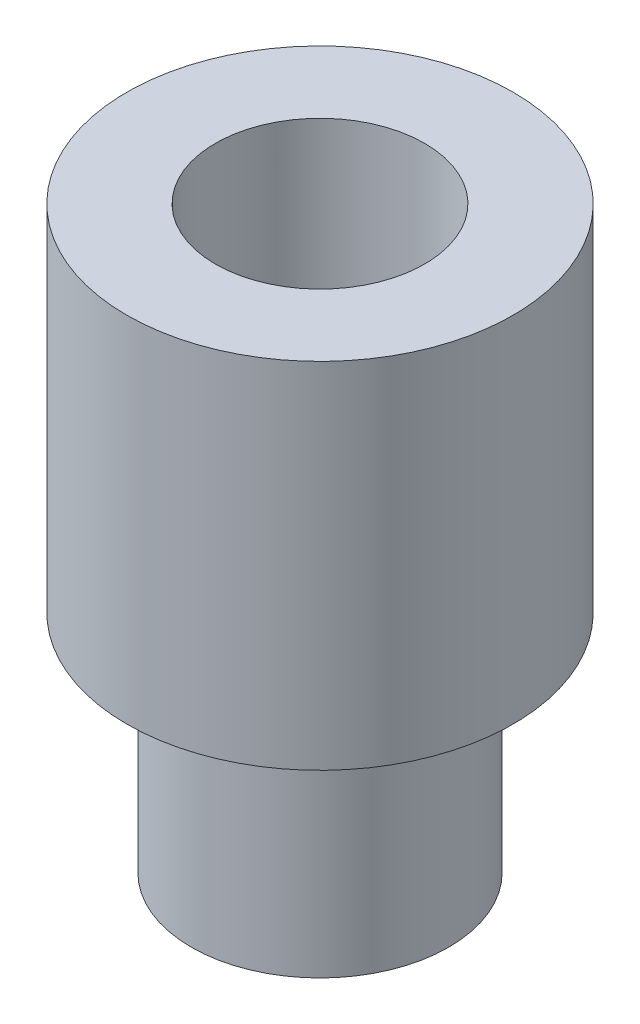
ISO-10303-21;
HEADER;
FILE_DESCRIPTION(('STEP AP214'),'2;1');
FILE_NAME('part.step','',(''),(''),'','','');
FILE_SCHEMA(('AUTOMOTIVE_DESIGN { 1 0 10303 214 1 1 1 1 }'));
ENDSEC;
DATA;
#1=APPLICATION_CONTEXT('core data for automotive mechanical design processes');
#2=APPLICATION_PROTOCOL_DEFINITION('international standard','automotive_design',2000,#1);
#3=PRODUCT_CONTEXT('',#1,'mechanical');
#4=PRODUCT('Part','Part','',(#3));
#5=PRODUCT_RELATED_PRODUCT_CATEGORY('part','',(#4));
#6=PRODUCT_DEFINITION_FORMATION('','',#4);
#7=PRODUCT_DEFINITION_CONTEXT('part definition',#1,'design');
#8=PRODUCT_DEFINITION('design','',#6,#7);
#9=PRODUCT_DEFINITION_SHAPE('','',#8);
#10=(LENGTH_UNIT() NAMED_UNIT(*) SI_UNIT(.MILLI.,.METRE.));
#11=(NAMED_UNIT(*) PLANE_ANGLE_UNIT() SI_UNIT($,.RADIAN.));
#12=(NAMED_UNIT(*) SI_UNIT($,.STERADIAN.) SOLID_ANGLE_UNIT());
#13=UNCERTAINTY_MEASURE_WITH_UNIT(LENGTH_MEASURE(1.E-05),#10,'distance_accuracy_value','');
#14=(GEOMETRIC_REPRESENTATION_CONTEXT(3) GLOBAL_UNCERTAINTY_ASSIGNED_CONTEXT((#13)) GLOBAL_UNIT_ASSIGNED_CONTEXT((#10,
#11,#12)) REPRESENTATION_CONTEXT('',''));
#15=CARTESIAN_POINT('',(0.,0.,0.));
#16=DIRECTION('',(0.,0.,1.));
#17=DIRECTION('',(1.,0.,0.));
#18=AXIS2_PLACEMENT_3D('',#15,#16,#17);
#19=CARTESIAN_POINT('',(0.,0.,0.));
#20=DIRECTION('',(0.,1.,0.));
#21=DIRECTION('',(0.,0.,1.));
#22=AXIS2_PLACEMENT_3D('',#19,#20,#21);
#23=PLANE('',#22);
#24=CARTESIAN_POINT('',(0.,0.,0.));
#25=DIRECTION('',(0.,1.,0.));
#26=DIRECTION('',(0.,0.,1.));
#27=AXIS2_PLACEMENT_3D('',#24,#25,#26);
#28=CIRCLE('',#27,6.);
#29=CARTESIAN_POINT('',(0.,0.,6.));
#30=VERTEX_POINT('',#29);
#31=EDGE_CURVE('E48',#30,#30,#28,.T.);
#32=ORIENTED_EDGE('',*,*,#31,.F.);
#33=EDGE_LOOP('',(#32));
#34=FACE_BOUND('',#33,.T.);
#35=CARTESIAN_POINT('',(0.,0.,0.));
#36=DIRECTION('',(0.,1.,0.));
#37=DIRECTION('',(0.,0.,1.));
#38=AXIS2_PLACEMENT_3D('',#35,#36,#37);
#39=CIRCLE('',#38,4.);
#40=CARTESIAN_POINT('',(0.,0.,4.));
#41=VERTEX_POINT('',#40);
#42=EDGE_CURVE('E10',#41,#41,#39,.F.);
#43=ORIENTED_EDGE('',*,*,#42,.F.);
#44=EDGE_LOOP('',(#43));
#45=FACE_BOUND('',#44,.T.);
#46=ADVANCED_FACE('F37',(#34,#45),#23,.F.);
#47=CARTESIAN_POINT('',(0.,11.,0.));
#48=DIRECTION('',(0.,1.,0.));
#49=DIRECTION('',(0.,0.,1.));
#50=AXIS2_PLACEMENT_3D('',#47,#48,#49);
#51=PLANE('',#50);
#52=CARTESIAN_POINT('',(0.,11.,0.));
#53=DIRECTION('',(0.,1.,0.));
#54=DIRECTION('',(0.,0.,1.));
#55=AXIS2_PLACEMENT_3D('',#52,#53,#54);
#56=CIRCLE('',#55,6.);
#57=CARTESIAN_POINT('',(0.,11.,6.));
#58=VERTEX_POINT('',#57);
#59=EDGE_CURVE('E44',#58,#58,#56,.T.);
#60=ORIENTED_EDGE('',*,*,#59,.T.);
#61=EDGE_LOOP('',(#60));
#62=FACE_BOUND('',#61,.T.);
#63=CARTESIAN_POINT('',(0.,11.,0.));
#64=DIRECTION('',(0.,1.,0.));
#65=DIRECTION('',(0.,0.,1.));
#66=AXIS2_PLACEMENT_3D('',#63,#64,#65);
#67=CIRCLE('',#66,3.25);
#68=CARTESIAN_POINT('',(0.,11.,3.25));
#69=VERTEX_POINT('',#68);
#70=EDGE_CURVE('E53',#69,#69,#67,.T.);
#71=ORIENTED_EDGE('',*,*,#70,.F.);
#72=EDGE_LOOP('',(#71));
#73=FACE_BOUND('',#72,.T.);
#74=ADVANCED_FACE('F80',(#62,#73),#51,.T.);
#75=CARTESIAN_POINT('',(0.,11.,0.));
#76=DIRECTION('',(0.,-1.,0.));
#77=DIRECTION('',(0.,0.,-1.));
#78=AXIS2_PLACEMENT_3D('',#75,#76,#77);
#79=CYLINDRICAL_SURFACE('',#78,6.);
#80=ORIENTED_EDGE('',*,*,#59,.F.);
#81=EDGE_LOOP('',(#80));
#82=FACE_BOUND('',#81,.T.);
#83=ORIENTED_EDGE('',*,*,#31,.T.);
#84=EDGE_LOOP('',(#83));
#85=FACE_BOUND('',#84,.T.);
#86=ADVANCED_FACE('F39',(#82,#85),#79,.T.);
#87=CARTESIAN_POINT('',(0.,11.,0.));
#88=DIRECTION('',(0.,-1.,0.));
#89=DIRECTION('',(0.,0.,-1.));
#90=AXIS2_PLACEMENT_3D('',#87,#88,#89);
#91=CYLINDRICAL_SURFACE('',#90,3.25);
#92=ORIENTED_EDGE('',*,*,#70,.T.);
#93=EDGE_LOOP('',(#92));
#94=FACE_BOUND('',#93,.T.);
#95=CARTESIAN_POINT('',(0.,-7.,0.));
#96=DIRECTION('',(0.,-1.,0.));
#97=DIRECTION('',(0.,0.,-1.));
#98=AXIS2_PLACEMENT_3D('',#95,#96,#97);
#99=CIRCLE('',#98,3.25);
#100=CARTESIAN_POINT('',(0.,-7.,-3.25));
#101=VERTEX_POINT('',#100);
#102=EDGE_CURVE('E60',#101,#101,#99,.T.);
#103=ORIENTED_EDGE('',*,*,#102,.T.);
#104=EDGE_LOOP('',(#103));
#105=FACE_BOUND('',#104,.T.);
#106=ADVANCED_FACE('F64',(#94,#105),#91,.F.);
#107=CARTESIAN_POINT('',(0.,-7.,0.));
#108=DIRECTION('',(0.,-1.,0.));
#109=DIRECTION('',(0.,0.,-1.));
#110=AXIS2_PLACEMENT_3D('',#107,#108,#109);
#111=PLANE('',#110);
#112=CARTESIAN_POINT('',(0.,-7.,0.));
#113=DIRECTION('',(0.,-1.,0.));
#114=DIRECTION('',(0.,0.,-1.));
#115=AXIS2_PLACEMENT_3D('',#112,#113,#114);
#116=CIRCLE('',#115,4.);
#117=CARTESIAN_POINT('',(0.,-7.,-4.));
#118=VERTEX_POINT('',#117);
#119=EDGE_CURVE('E57',#118,#118,#116,.T.);
#120=ORIENTED_EDGE('',*,*,#119,.T.);
#121=EDGE_LOOP('',(#120));
#122=FACE_BOUND('',#121,.T.);
#123=ORIENTED_EDGE('',*,*,#102,.F.);
#124=EDGE_LOOP('',(#123));
#125=FACE_BOUND('',#124,.T.);
#126=ADVANCED_FACE('F66',(#122,#125),#111,.T.);
#127=CARTESIAN_POINT('',(0.,-7.,0.));
#128=DIRECTION('',(0.,1.,0.));
#129=DIRECTION('',(0.,0.,1.));
#130=AXIS2_PLACEMENT_3D('',#127,#128,#129);
#131=CYLINDRICAL_SURFACE('',#130,4.);
#132=ORIENTED_EDGE('',*,*,#119,.F.);
#133=EDGE_LOOP('',(#132));
#134=FACE_BOUND('',#133,.T.);
#135=ORIENTED_EDGE('',*,*,#42,.T.);
#136=EDGE_LOOP('',(#135));
#137=FACE_BOUND('',#136,.T.);
#138=ADVANCED_FACE('F68',(#134,#137),#131,.T.);
#139=CLOSED_SHELL('',(#46,#74,#86,#106,#126,#138));
#140=MANIFOLD_SOLID_BREP('B2',#139);
#141=ADVANCED_BREP_SHAPE_REPRESENTATION('',(#18,#140),#14);
#142=SHAPE_DEFINITION_REPRESENTATION(#9,#141);
ENDSEC;
END-ISO-10303-21;
